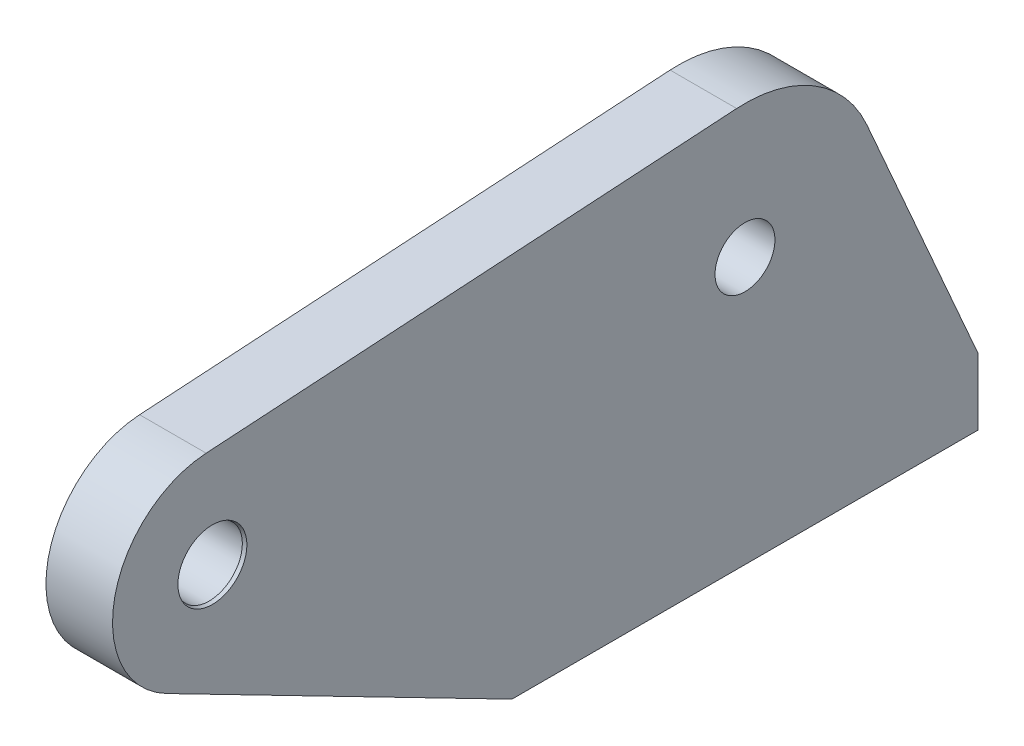
ISO-10303-21;
HEADER;
FILE_DESCRIPTION(('STEP AP214'),'2;1');
FILE_NAME('part.step','',(''),(''),'','','');
FILE_SCHEMA(('AUTOMOTIVE_DESIGN { 1 0 10303 214 1 1 1 1 }'));
ENDSEC;
DATA;
#1=APPLICATION_CONTEXT('core data for automotive mechanical design processes');
#2=APPLICATION_PROTOCOL_DEFINITION('international standard','automotive_design',2000,#1);
#3=PRODUCT_CONTEXT('',#1,'mechanical');
#4=PRODUCT('Part','Part','',(#3));
#5=PRODUCT_RELATED_PRODUCT_CATEGORY('part','',(#4));
#6=PRODUCT_DEFINITION_FORMATION('','',#4);
#7=PRODUCT_DEFINITION_CONTEXT('part definition',#1,'design');
#8=PRODUCT_DEFINITION('design','',#6,#7);
#9=PRODUCT_DEFINITION_SHAPE('','',#8);
#10=(LENGTH_UNIT() NAMED_UNIT(*) SI_UNIT(.MILLI.,.METRE.));
#11=(NAMED_UNIT(*) PLANE_ANGLE_UNIT() SI_UNIT($,.RADIAN.));
#12=(NAMED_UNIT(*) SI_UNIT($,.STERADIAN.) SOLID_ANGLE_UNIT());
#13=UNCERTAINTY_MEASURE_WITH_UNIT(LENGTH_MEASURE(1.E-05),#10,'distance_accuracy_value','');
#14=(GEOMETRIC_REPRESENTATION_CONTEXT(3) GLOBAL_UNCERTAINTY_ASSIGNED_CONTEXT((#13)) GLOBAL_UNIT_ASSIGNED_CONTEXT((#10,
#11,#12)) REPRESENTATION_CONTEXT('',''));
#15=CARTESIAN_POINT('',(0.,0.,0.));
#16=DIRECTION('',(0.,0.,1.));
#17=DIRECTION('',(1.,0.,0.));
#18=AXIS2_PLACEMENT_3D('',#15,#16,#17);
#19=CARTESIAN_POINT('',(5.,0.,0.));
#20=DIRECTION('',(-1.,0.,0.));
#21=DIRECTION('',(0.,0.,1.));
#22=AXIS2_PLACEMENT_3D('',#19,#20,#21);
#23=CYLINDRICAL_SURFACE('',#22,20.);
#24=DIRECTION('',(1.,0.,0.));
#25=VECTOR('',#24,1.);
#26=CARTESIAN_POINT('',(-5.,19.9608992783391,1.25));
#27=LINE('',#26,#25);
#28=CARTESIAN_POINT('',(-5.,19.9608992783391,1.25));
#29=VERTEX_POINT('',#28);
#30=CARTESIAN_POINT('',(5.,19.9608992783391,1.25));
#31=VERTEX_POINT('',#30);
#32=EDGE_CURVE('E78',#29,#31,#27,.T.);
#33=ORIENTED_EDGE('',*,*,#32,.T.);
#34=CARTESIAN_POINT('',(5.,0.,0.));
#35=DIRECTION('',(1.,0.,0.));
#36=DIRECTION('',(0.,0.,-1.));
#37=AXIS2_PLACEMENT_3D('',#34,#35,#36);
#38=CIRCLE('',#37,20.);
#39=CARTESIAN_POINT('',(5.,8.03443930362977,-18.3152336888255));
#40=VERTEX_POINT('',#39);
#41=EDGE_CURVE('E234',#40,#31,#38,.T.);
#42=ORIENTED_EDGE('',*,*,#41,.F.);
#43=DIRECTION('',(-1.,0.,0.));
#44=VECTOR('',#43,1.);
#45=CARTESIAN_POINT('',(5.,8.03443930362977,-18.3152336888255));
#46=LINE('',#45,#44);
#47=CARTESIAN_POINT('',(-5.,8.03443930362977,-18.3152336888255));
#48=VERTEX_POINT('',#47);
#49=EDGE_CURVE('E237',#40,#48,#46,.T.);
#50=ORIENTED_EDGE('',*,*,#49,.T.);
#51=CARTESIAN_POINT('',(-5.,0.,0.));
#52=DIRECTION('',(1.,0.,0.));
#53=DIRECTION('',(0.,0.,-1.));
#54=AXIS2_PLACEMENT_3D('',#51,#52,#53);
#55=CIRCLE('',#54,20.);
#56=EDGE_CURVE('E84',#48,#29,#55,.T.);
#57=ORIENTED_EDGE('',*,*,#56,.T.);
#58=EDGE_LOOP('',(#33,#42,#50,#57));
#59=FACE_BOUND('',#58,.T.);
#60=ADVANCED_FACE('F58',(#59),#23,.T.);
#61=CARTESIAN_POINT('',(5.,-40.,35.));
#62=DIRECTION('',(0.,1.,0.));
#63=DIRECTION('',(0.,0.,1.));
#64=AXIS2_PLACEMENT_3D('',#61,#62,#63);
#65=PLANE('',#64);
#66=CARTESIAN_POINT('',(0.,-40.,25.));
#67=DIRECTION('',(0.,-1.,0.));
#68=DIRECTION('',(0.,0.,-1.));
#69=AXIS2_PLACEMENT_3D('',#66,#67,#68);
#70=CIRCLE('',#69,1.65);
#71=CARTESIAN_POINT('',(0.,-40.,23.35));
#72=VERTEX_POINT('',#71);
#73=EDGE_CURVE('E187',#72,#72,#70,.T.);
#74=ORIENTED_EDGE('',*,*,#73,.F.);
#75=EDGE_LOOP('',(#74));
#76=FACE_BOUND('',#75,.T.);
#77=CARTESIAN_POINT('',(0.,-40.,10.));
#78=DIRECTION('',(0.,-1.,0.));
#79=DIRECTION('',(0.,0.,-1.));
#80=AXIS2_PLACEMENT_3D('',#77,#78,#79);
#81=CIRCLE('',#80,1.65);
#82=CARTESIAN_POINT('',(0.,-40.,8.35000000000001));
#83=VERTEX_POINT('',#82);
#84=EDGE_CURVE('E197',#83,#83,#81,.T.);
#85=ORIENTED_EDGE('',*,*,#84,.F.);
#86=EDGE_LOOP('',(#85));
#87=FACE_BOUND('',#86,.T.);
#88=CARTESIAN_POINT('',(0.,-40.,-10.));
#89=DIRECTION('',(0.,-1.,0.));
#90=DIRECTION('',(0.,0.,-1.));
#91=AXIS2_PLACEMENT_3D('',#88,#89,#90);
#92=CIRCLE('',#91,1.65);
#93=CARTESIAN_POINT('',(0.,-40.,-11.65));
#94=VERTEX_POINT('',#93);
#95=EDGE_CURVE('E205',#94,#94,#92,.T.);
#96=ORIENTED_EDGE('',*,*,#95,.F.);
#97=EDGE_LOOP('',(#96));
#98=FACE_BOUND('',#97,.T.);
#99=CARTESIAN_POINT('',(0.,-40.,-25.));
#100=DIRECTION('',(0.,-1.,0.));
#101=DIRECTION('',(0.,0.,-1.));
#102=AXIS2_PLACEMENT_3D('',#99,#100,#101);
#103=CIRCLE('',#102,1.65);
#104=CARTESIAN_POINT('',(0.,-40.,-26.65));
#105=VERTEX_POINT('',#104);
#106=EDGE_CURVE('E212',#105,#105,#103,.T.);
#107=ORIENTED_EDGE('',*,*,#106,.F.);
#108=EDGE_LOOP('',(#107));
#109=FACE_BOUND('',#108,.T.);
#110=DIRECTION('',(0.,0.,-1.));
#111=VECTOR('',#110,1.);
#112=CARTESIAN_POINT('',(-5.,-40.,35.));
#113=LINE('',#112,#111);
#114=CARTESIAN_POINT('',(-5.,-40.,35.));
#115=VERTEX_POINT('',#114);
#116=CARTESIAN_POINT('',(-5.,-40.,-35.));
#117=VERTEX_POINT('',#116);
#118=EDGE_CURVE('E165',#115,#117,#113,.T.);
#119=ORIENTED_EDGE('',*,*,#118,.T.);
#120=DIRECTION('',(-1.,0.,0.));
#121=VECTOR('',#120,1.);
#122=CARTESIAN_POINT('',(5.,-40.,-35.));
#123=LINE('',#122,#121);
#124=CARTESIAN_POINT('',(5.,-40.,-35.));
#125=VERTEX_POINT('',#124);
#126=EDGE_CURVE('E252',#125,#117,#123,.T.);
#127=ORIENTED_EDGE('',*,*,#126,.F.);
#128=DIRECTION('',(0.,0.,-1.));
#129=VECTOR('',#128,1.);
#130=CARTESIAN_POINT('',(5.,-40.,35.));
#131=LINE('',#130,#129);
#132=CARTESIAN_POINT('',(5.,-40.,35.));
#133=VERTEX_POINT('',#132);
#134=EDGE_CURVE('E226',#133,#125,#131,.T.);
#135=ORIENTED_EDGE('',*,*,#134,.F.);
#136=DIRECTION('',(-1.,0.,0.));
#137=VECTOR('',#136,1.);
#138=CARTESIAN_POINT('',(5.,-40.,35.));
#139=LINE('',#138,#137);
#140=EDGE_CURVE('E255',#133,#115,#139,.T.);
#141=ORIENTED_EDGE('',*,*,#140,.T.);
#142=EDGE_LOOP('',(#119,#127,#135,#141));
#143=FACE_BOUND('',#142,.T.);
#144=ADVANCED_FACE('F292',(#76,#87,#98,#109,#143),#65,.F.);
#145=CARTESIAN_POINT('',(5.,-30.,-35.));
#146=DIRECTION('',(0.,0.,1.));
#147=DIRECTION('',(0.,-1.,0.));
#148=AXIS2_PLACEMENT_3D('',#145,#146,#147);
#149=PLANE('',#148);
#150=DIRECTION('',(0.,1.,0.));
#151=VECTOR('',#150,1.);
#152=CARTESIAN_POINT('',(-5.,-30.,-35.));
#153=LINE('',#152,#151);
#154=CARTESIAN_POINT('',(-5.,-30.,-35.));
#155=VERTEX_POINT('',#154);
#156=EDGE_CURVE('E240',#117,#155,#153,.T.);
#157=ORIENTED_EDGE('',*,*,#156,.T.);
#158=DIRECTION('',(-1.,0.,0.));
#159=VECTOR('',#158,1.);
#160=CARTESIAN_POINT('',(5.,-30.,-35.));
#161=LINE('',#160,#159);
#162=CARTESIAN_POINT('',(5.,-30.,-35.));
#163=VERTEX_POINT('',#162);
#164=EDGE_CURVE('E249',#163,#155,#161,.T.);
#165=ORIENTED_EDGE('',*,*,#164,.F.);
#166=DIRECTION('',(0.,1.,0.));
#167=VECTOR('',#166,1.);
#168=CARTESIAN_POINT('',(5.,-30.,-35.));
#169=LINE('',#168,#167);
#170=EDGE_CURVE('E229',#125,#163,#169,.T.);
#171=ORIENTED_EDGE('',*,*,#170,.F.);
#172=ORIENTED_EDGE('',*,*,#126,.T.);
#173=EDGE_LOOP('',(#157,#165,#171,#172));
#174=FACE_BOUND('',#173,.T.);
#175=ADVANCED_FACE('F296',(#174),#149,.F.);
#176=CARTESIAN_POINT('',(5.,-30.,-35.));
#177=DIRECTION('',(0.,-0.401721965181489,0.915761684441276));
#178=DIRECTION('',(0.,-0.915761684441276,-0.401721965181489));
#179=AXIS2_PLACEMENT_3D('',#176,#177,#178);
#180=PLANE('',#179);
#181=DIRECTION('',(0.,0.915761684441276,0.401721965181489));
#182=VECTOR('',#181,1.);
#183=CARTESIAN_POINT('',(-5.,-30.,-35.));
#184=LINE('',#183,#182);
#185=EDGE_CURVE('E242',#155,#48,#184,.T.);
#186=ORIENTED_EDGE('',*,*,#185,.T.);
#187=ORIENTED_EDGE('',*,*,#49,.F.);
#188=DIRECTION('',(0.,0.915761684441276,0.401721965181489));
#189=VECTOR('',#188,1.);
#190=CARTESIAN_POINT('',(5.,-30.,-35.));
#191=LINE('',#190,#189);
#192=EDGE_CURVE('E231',#163,#40,#191,.T.);
#193=ORIENTED_EDGE('',*,*,#192,.F.);
#194=ORIENTED_EDGE('',*,*,#164,.T.);
#195=EDGE_LOOP('',(#186,#187,#193,#194));
#196=FACE_BOUND('',#195,.T.);
#197=ADVANCED_FACE('F287',(#196),#180,.F.);
#198=CARTESIAN_POINT('',(5.,0.,0.));
#199=DIRECTION('',(1.,0.,0.));
#200=DIRECTION('',(0.,0.,-1.));
#201=AXIS2_PLACEMENT_3D('',#198,#199,#200);
#202=PLANE('',#201);
#203=CARTESIAN_POINT('',(5.,0.,80.));
#204=DIRECTION('',(1.,0.,0.));
#205=DIRECTION('',(0.,0.,-1.));
#206=AXIS2_PLACEMENT_3D('',#203,#204,#205);
#207=CIRCLE('',#206,5.1819851171331);
#208=CARTESIAN_POINT('',(5.,0.,74.8180148828669));
#209=VERTEX_POINT('',#208);
#210=EDGE_CURVE('E11',#209,#209,#207,.F.);
#211=ORIENTED_EDGE('',*,*,#210,.T.);
#212=EDGE_LOOP('',(#211));
#213=FACE_BOUND('',#212,.T.);
#214=ORIENTED_EDGE('',*,*,#41,.T.);
#215=DIRECTION('',(0.,-0.0624999999999998,0.998044963916957));
#216=VECTOR('',#215,1.);
#217=CARTESIAN_POINT('',(5.,14.9706744587544,80.9375));
#218=LINE('',#217,#216);
#219=CARTESIAN_POINT('',(5.,14.9706744587544,80.9375));
#220=VERTEX_POINT('',#219);
#221=EDGE_CURVE('E171',#31,#220,#218,.T.);
#222=ORIENTED_EDGE('',*,*,#221,.T.);
#223=CARTESIAN_POINT('',(5.,0.,80.));
#224=DIRECTION('',(1.,0.,0.));
#225=DIRECTION('',(0.,0.,-1.));
#226=AXIS2_PLACEMENT_3D('',#223,#224,#225);
#227=CIRCLE('',#226,15.);
#228=CARTESIAN_POINT('',(5.,-13.340393183505,86.8581272742267));
#229=VERTEX_POINT('',#228);
#230=EDGE_CURVE('E181',#220,#229,#227,.T.);
#231=ORIENTED_EDGE('',*,*,#230,.T.);
#232=DIRECTION('',(0.,-0.457208484948447,-0.889359545567003));
#233=VECTOR('',#232,1.);
#234=CARTESIAN_POINT('',(5.,-13.340393183505,86.8581272742267));
#235=LINE('',#234,#233);
#236=EDGE_CURVE('E148',#229,#133,#235,.T.);
#237=ORIENTED_EDGE('',*,*,#236,.T.);
#238=ORIENTED_EDGE('',*,*,#134,.T.);
#239=ORIENTED_EDGE('',*,*,#170,.T.);
#240=ORIENTED_EDGE('',*,*,#192,.T.);
#241=EDGE_LOOP('',(#214,#222,#231,#237,#238,#239,#240));
#242=FACE_BOUND('',#241,.T.);
#243=CARTESIAN_POINT('',(5.,0.,0.));
#244=DIRECTION('',(1.,0.,0.));
#245=DIRECTION('',(0.,0.,-1.));
#246=AXIS2_PLACEMENT_3D('',#243,#244,#245);
#247=CIRCLE('',#246,4.5);
#248=CARTESIAN_POINT('',(5.,0.,-4.5));
#249=VERTEX_POINT('',#248);
#250=EDGE_CURVE('E218',#249,#249,#247,.T.);
#251=ORIENTED_EDGE('',*,*,#250,.F.);
#252=EDGE_LOOP('',(#251));
#253=FACE_BOUND('',#252,.T.);
#254=ADVANCED_FACE('F278',(#213,#242,#253),#202,.T.);
#255=CARTESIAN_POINT('',(-5.,0.,0.));
#256=DIRECTION('',(1.,0.,0.));
#257=DIRECTION('',(0.,0.,-1.));
#258=AXIS2_PLACEMENT_3D('',#255,#256,#257);
#259=PLANE('',#258);
#260=CARTESIAN_POINT('',(-5.,0.,80.));
#261=DIRECTION('',(1.,0.,0.));
#262=DIRECTION('',(0.,0.,-1.));
#263=AXIS2_PLACEMENT_3D('',#260,#261,#262);
#264=CIRCLE('',#263,5.1819851171331);
#265=CARTESIAN_POINT('',(-5.,0.,74.8180148828669));
#266=VERTEX_POINT('',#265);
#267=EDGE_CURVE('E258',#266,#266,#264,.T.);
#268=ORIENTED_EDGE('',*,*,#267,.T.);
#269=EDGE_LOOP('',(#268));
#270=FACE_BOUND('',#269,.T.);
#271=DIRECTION('',(0.,-0.0624999999999998,0.998044963916957));
#272=VECTOR('',#271,1.);
#273=CARTESIAN_POINT('',(-5.,14.9706744587544,80.9375));
#274=LINE('',#273,#272);
#275=CARTESIAN_POINT('',(-5.,14.9706744587544,80.9375));
#276=VERTEX_POINT('',#275);
#277=EDGE_CURVE('E154',#29,#276,#274,.T.);
#278=ORIENTED_EDGE('',*,*,#277,.F.);
#279=ORIENTED_EDGE('',*,*,#56,.F.);
#280=ORIENTED_EDGE('',*,*,#185,.F.);
#281=ORIENTED_EDGE('',*,*,#156,.F.);
#282=ORIENTED_EDGE('',*,*,#118,.F.);
#283=DIRECTION('',(0.,-0.457208484948447,-0.889359545567003));
#284=VECTOR('',#283,1.);
#285=CARTESIAN_POINT('',(-5.,-13.340393183505,86.8581272742267));
#286=LINE('',#285,#284);
#287=CARTESIAN_POINT('',(-5.,-13.340393183505,86.8581272742267));
#288=VERTEX_POINT('',#287);
#289=EDGE_CURVE('E146',#288,#115,#286,.T.);
#290=ORIENTED_EDGE('',*,*,#289,.F.);
#291=CARTESIAN_POINT('',(-5.,0.,80.));
#292=DIRECTION('',(1.,0.,0.));
#293=DIRECTION('',(0.,0.,-1.));
#294=AXIS2_PLACEMENT_3D('',#291,#292,#293);
#295=CIRCLE('',#294,15.);
#296=EDGE_CURVE('E162',#276,#288,#295,.T.);
#297=ORIENTED_EDGE('',*,*,#296,.F.);
#298=EDGE_LOOP('',(#278,#279,#280,#281,#282,#290,#297));
#299=FACE_BOUND('',#298,.T.);
#300=CARTESIAN_POINT('',(-5.,0.,0.));
#301=DIRECTION('',(1.,0.,0.));
#302=DIRECTION('',(0.,0.,-1.));
#303=AXIS2_PLACEMENT_3D('',#300,#301,#302);
#304=CIRCLE('',#303,4.5);
#305=CARTESIAN_POINT('',(-5.,0.,-4.5));
#306=VERTEX_POINT('',#305);
#307=EDGE_CURVE('E222',#306,#306,#304,.T.);
#308=ORIENTED_EDGE('',*,*,#307,.T.);
#309=EDGE_LOOP('',(#308));
#310=FACE_BOUND('',#309,.T.);
#311=ADVANCED_FACE('F160',(#270,#299,#310),#259,.F.);
#312=CARTESIAN_POINT('',(5.,0.,0.));
#313=DIRECTION('',(1.,0.,0.));
#314=DIRECTION('',(0.,0.,-1.));
#315=AXIS2_PLACEMENT_3D('',#312,#313,#314);
#316=CYLINDRICAL_SURFACE('',#315,4.5);
#317=ORIENTED_EDGE('',*,*,#307,.F.);
#318=EDGE_LOOP('',(#317));
#319=FACE_BOUND('',#318,.T.);
#320=ORIENTED_EDGE('',*,*,#250,.T.);
#321=EDGE_LOOP('',(#320));
#322=FACE_BOUND('',#321,.T.);
#323=ADVANCED_FACE('F277',(#319,#322),#316,.F.);
#324=CARTESIAN_POINT('',(0.,-28.5,-25.));
#325=DIRECTION('',(0.,-1.,0.));
#326=DIRECTION('',(0.,0.,-1.));
#327=AXIS2_PLACEMENT_3D('',#324,#325,#326);
#328=CONICAL_SURFACE('',#327,1.65,1.02974425867665);
#329=CARTESIAN_POINT('',(0.,-27.5085799786045,-25.));
#330=VERTEX_POINT('',#329);
#331=VERTEX_LOOP('',#330);
#332=FACE_BOUND('',#331,.T.);
#333=CARTESIAN_POINT('',(0.,-28.5,-25.));
#334=DIRECTION('',(0.,-1.,0.));
#335=DIRECTION('',(0.,0.,-1.));
#336=AXIS2_PLACEMENT_3D('',#333,#334,#335);
#337=CIRCLE('',#336,1.65);
#338=CARTESIAN_POINT('',(0.,-28.5,-26.65));
#339=VERTEX_POINT('',#338);
#340=EDGE_CURVE('E215',#339,#339,#337,.T.);
#341=ORIENTED_EDGE('',*,*,#340,.T.);
#342=EDGE_LOOP('',(#341));
#343=FACE_BOUND('',#342,.T.);
#344=ADVANCED_FACE('F283',(#332,#343),#328,.F.);
#345=CARTESIAN_POINT('',(0.,-40.,-25.));
#346=DIRECTION('',(0.,-1.,0.));
#347=DIRECTION('',(0.,0.,-1.));
#348=AXIS2_PLACEMENT_3D('',#345,#346,#347);
#349=CYLINDRICAL_SURFACE('',#348,1.65);
#350=ORIENTED_EDGE('',*,*,#340,.F.);
#351=EDGE_LOOP('',(#350));
#352=FACE_BOUND('',#351,.T.);
#353=ORIENTED_EDGE('',*,*,#106,.T.);
#354=EDGE_LOOP('',(#353));
#355=FACE_BOUND('',#354,.T.);
#356=ADVANCED_FACE('F359',(#352,#355),#349,.F.);
#357=CARTESIAN_POINT('',(0.,-28.5,-10.));
#358=DIRECTION('',(0.,-1.,0.));
#359=DIRECTION('',(0.,0.,-1.));
#360=AXIS2_PLACEMENT_3D('',#357,#358,#359);
#361=CONICAL_SURFACE('',#360,1.65,1.02974425867665);
#362=CARTESIAN_POINT('',(0.,-27.5085799786045,-10.));
#363=VERTEX_POINT('',#362);
#364=VERTEX_LOOP('',#363);
#365=FACE_BOUND('',#364,.T.);
#366=CARTESIAN_POINT('',(0.,-28.5,-10.));
#367=DIRECTION('',(0.,-1.,0.));
#368=DIRECTION('',(0.,0.,-1.));
#369=AXIS2_PLACEMENT_3D('',#366,#367,#368);
#370=CIRCLE('',#369,1.65);
#371=CARTESIAN_POINT('',(0.,-28.5,-11.65));
#372=VERTEX_POINT('',#371);
#373=EDGE_CURVE('E208',#372,#372,#370,.T.);
#374=ORIENTED_EDGE('',*,*,#373,.T.);
#375=EDGE_LOOP('',(#374));
#376=FACE_BOUND('',#375,.T.);
#377=ADVANCED_FACE('F355',(#365,#376),#361,.F.);
#378=CARTESIAN_POINT('',(0.,-40.,-10.));
#379=DIRECTION('',(0.,-1.,0.));
#380=DIRECTION('',(0.,0.,-1.));
#381=AXIS2_PLACEMENT_3D('',#378,#379,#380);
#382=CYLINDRICAL_SURFACE('',#381,1.65);
#383=ORIENTED_EDGE('',*,*,#373,.F.);
#384=EDGE_LOOP('',(#383));
#385=FACE_BOUND('',#384,.T.);
#386=ORIENTED_EDGE('',*,*,#95,.T.);
#387=EDGE_LOOP('',(#386));
#388=FACE_BOUND('',#387,.T.);
#389=ADVANCED_FACE('F351',(#385,#388),#382,.F.);
#390=CARTESIAN_POINT('',(0.,-28.5,10.));
#391=DIRECTION('',(0.,-1.,0.));
#392=DIRECTION('',(0.,0.,-1.));
#393=AXIS2_PLACEMENT_3D('',#390,#391,#392);
#394=CONICAL_SURFACE('',#393,1.65,1.02974425867665);
#395=CARTESIAN_POINT('',(0.,-27.5085799786045,10.));
#396=VERTEX_POINT('',#395);
#397=VERTEX_LOOP('',#396);
#398=FACE_BOUND('',#397,.T.);
#399=CARTESIAN_POINT('',(0.,-28.5,10.));
#400=DIRECTION('',(0.,-1.,0.));
#401=DIRECTION('',(0.,0.,-1.));
#402=AXIS2_PLACEMENT_3D('',#399,#400,#401);
#403=CIRCLE('',#402,1.65);
#404=CARTESIAN_POINT('',(0.,-28.5,8.35000000000001));
#405=VERTEX_POINT('',#404);
#406=EDGE_CURVE('E201',#405,#405,#403,.T.);
#407=ORIENTED_EDGE('',*,*,#406,.T.);
#408=EDGE_LOOP('',(#407));
#409=FACE_BOUND('',#408,.T.);
#410=ADVANCED_FACE('F347',(#398,#409),#394,.F.);
#411=CARTESIAN_POINT('',(0.,-40.,10.));
#412=DIRECTION('',(0.,-1.,0.));
#413=DIRECTION('',(0.,0.,-1.));
#414=AXIS2_PLACEMENT_3D('',#411,#412,#413);
#415=CYLINDRICAL_SURFACE('',#414,1.65);
#416=ORIENTED_EDGE('',*,*,#406,.F.);
#417=EDGE_LOOP('',(#416));
#418=FACE_BOUND('',#417,.T.);
#419=ORIENTED_EDGE('',*,*,#84,.T.);
#420=EDGE_LOOP('',(#419));
#421=FACE_BOUND('',#420,.T.);
#422=ADVANCED_FACE('F343',(#418,#421),#415,.F.);
#423=CARTESIAN_POINT('',(0.,-28.5,25.));
#424=DIRECTION('',(0.,-1.,0.));
#425=DIRECTION('',(0.,0.,-1.));
#426=AXIS2_PLACEMENT_3D('',#423,#424,#425);
#427=CONICAL_SURFACE('',#426,1.65,1.02974425867665);
#428=CARTESIAN_POINT('',(0.,-27.5085799786045,25.));
#429=VERTEX_POINT('',#428);
#430=VERTEX_LOOP('',#429);
#431=FACE_BOUND('',#430,.T.);
#432=CARTESIAN_POINT('',(0.,-28.5,25.));
#433=DIRECTION('',(0.,-1.,0.));
#434=DIRECTION('',(0.,0.,-1.));
#435=AXIS2_PLACEMENT_3D('',#432,#433,#434);
#436=CIRCLE('',#435,1.65);
#437=CARTESIAN_POINT('',(0.,-28.5,23.35));
#438=VERTEX_POINT('',#437);
#439=EDGE_CURVE('E193',#438,#438,#436,.T.);
#440=ORIENTED_EDGE('',*,*,#439,.T.);
#441=EDGE_LOOP('',(#440));
#442=FACE_BOUND('',#441,.T.);
#443=ADVANCED_FACE('F339',(#431,#442),#427,.F.);
#444=CARTESIAN_POINT('',(0.,-40.,25.));
#445=DIRECTION('',(0.,-1.,0.));
#446=DIRECTION('',(0.,0.,-1.));
#447=AXIS2_PLACEMENT_3D('',#444,#445,#446);
#448=CYLINDRICAL_SURFACE('',#447,1.65);
#449=ORIENTED_EDGE('',*,*,#439,.F.);
#450=EDGE_LOOP('',(#449));
#451=FACE_BOUND('',#450,.T.);
#452=ORIENTED_EDGE('',*,*,#73,.T.);
#453=EDGE_LOOP('',(#452));
#454=FACE_BOUND('',#453,.T.);
#455=ADVANCED_FACE('F333',(#451,#454),#448,.F.);
#456=CARTESIAN_POINT('',(-5.,0.,80.));
#457=DIRECTION('',(1.,0.,0.));
#458=DIRECTION('',(0.,0.,-1.));
#459=AXIS2_PLACEMENT_3D('',#456,#457,#458);
#460=CYLINDRICAL_SURFACE('',#459,15.);
#461=ORIENTED_EDGE('',*,*,#230,.F.);
#462=DIRECTION('',(1.,0.,0.));
#463=VECTOR('',#462,1.);
#464=CARTESIAN_POINT('',(-5.,14.9706744587544,80.9375));
#465=LINE('',#464,#463);
#466=EDGE_CURVE('E169',#276,#220,#465,.T.);
#467=ORIENTED_EDGE('',*,*,#466,.F.);
#468=ORIENTED_EDGE('',*,*,#296,.T.);
#469=DIRECTION('',(1.,0.,0.));
#470=VECTOR('',#469,1.);
#471=CARTESIAN_POINT('',(-5.,-13.340393183505,86.8581272742267));
#472=LINE('',#471,#470);
#473=EDGE_CURVE('E142',#288,#229,#472,.T.);
#474=ORIENTED_EDGE('',*,*,#473,.T.);
#475=EDGE_LOOP('',(#461,#467,#468,#474));
#476=FACE_BOUND('',#475,.T.);
#477=ADVANCED_FACE('F168',(#476),#460,.T.);
#478=CARTESIAN_POINT('',(-5.,14.9706744587544,80.9375));
#479=DIRECTION('',(0.,0.998044963916957,0.0624999999999999));
#480=DIRECTION('',(0.,-0.0624999999999999,0.998044963916957));
#481=AXIS2_PLACEMENT_3D('',#478,#479,#480);
#482=PLANE('',#481);
#483=ORIENTED_EDGE('',*,*,#221,.F.);
#484=ORIENTED_EDGE('',*,*,#32,.F.);
#485=ORIENTED_EDGE('',*,*,#277,.T.);
#486=ORIENTED_EDGE('',*,*,#466,.T.);
#487=EDGE_LOOP('',(#483,#484,#485,#486));
#488=FACE_BOUND('',#487,.T.);
#489=ADVANCED_FACE('F320',(#488),#482,.T.);
#490=CARTESIAN_POINT('',(-5.,-13.340393183505,86.8581272742267));
#491=DIRECTION('',(0.,-0.889359545567003,0.457208484948447));
#492=DIRECTION('',(0.,-0.457208484948447,-0.889359545567003));
#493=AXIS2_PLACEMENT_3D('',#490,#491,#492);
#494=PLANE('',#493);
#495=ORIENTED_EDGE('',*,*,#236,.F.);
#496=ORIENTED_EDGE('',*,*,#473,.F.);
#497=ORIENTED_EDGE('',*,*,#289,.T.);
#498=ORIENTED_EDGE('',*,*,#140,.F.);
#499=EDGE_LOOP('',(#495,#496,#497,#498));
#500=FACE_BOUND('',#499,.T.);
#501=ADVANCED_FACE('F144',(#500),#494,.T.);
#502=CARTESIAN_POINT('',(-5.,0.,80.));
#503=DIRECTION('',(1.,0.,0.));
#504=DIRECTION('',(0.,0.,-1.));
#505=AXIS2_PLACEMENT_3D('',#502,#503,#504);
#506=CYLINDRICAL_SURFACE('',#505,5.);
#507=CARTESIAN_POINT('',(-4.50000000000001,0.,80.));
#508=DIRECTION('',(1.,0.,0.));
#509=DIRECTION('',(0.,0.,-1.));
#510=AXIS2_PLACEMENT_3D('',#507,#508,#509);
#511=CIRCLE('',#510,5.);
#512=CARTESIAN_POINT('',(-4.50000000000001,0.,75.));
#513=VERTEX_POINT('',#512);
#514=EDGE_CURVE('E68',#513,#513,#511,.F.);
#515=ORIENTED_EDGE('',*,*,#514,.T.);
#516=EDGE_LOOP('',(#515));
#517=FACE_BOUND('',#516,.T.);
#518=CARTESIAN_POINT('',(4.50000000000001,0.,80.));
#519=DIRECTION('',(1.,0.,0.));
#520=DIRECTION('',(0.,0.,-1.));
#521=AXIS2_PLACEMENT_3D('',#518,#519,#520);
#522=CIRCLE('',#521,5.);
#523=CARTESIAN_POINT('',(4.50000000000001,0.,75.));
#524=VERTEX_POINT('',#523);
#525=EDGE_CURVE('E262',#524,#524,#522,.T.);
#526=ORIENTED_EDGE('',*,*,#525,.T.);
#527=EDGE_LOOP('',(#526));
#528=FACE_BOUND('',#527,.T.);
#529=ADVANCED_FACE('F268',(#517,#528),#506,.F.);
#530=CARTESIAN_POINT('',(-5.,0.,80.));
#531=DIRECTION('',(-1.,0.,0.));
#532=DIRECTION('',(0.,0.,1.));
#533=AXIS2_PLACEMENT_3D('',#530,#531,#532);
#534=CONICAL_SURFACE('',#533,5.1819851171331,0.349065850398852);
#535=ORIENTED_EDGE('',*,*,#514,.F.);
#536=EDGE_LOOP('',(#535));
#537=FACE_BOUND('',#536,.T.);
#538=ORIENTED_EDGE('',*,*,#267,.F.);
#539=EDGE_LOOP('',(#538));
#540=FACE_BOUND('',#539,.T.);
#541=ADVANCED_FACE('F271',(#537,#540),#534,.F.);
#542=CARTESIAN_POINT('',(4.50000000000001,0.,80.));
#543=DIRECTION('',(1.,0.,0.));
#544=DIRECTION('',(0.,0.,-1.));
#545=AXIS2_PLACEMENT_3D('',#542,#543,#544);
#546=CONICAL_SURFACE('',#545,5.,0.349065850398852);
#547=ORIENTED_EDGE('',*,*,#210,.F.);
#548=EDGE_LOOP('',(#547));
#549=FACE_BOUND('',#548,.T.);
#550=ORIENTED_EDGE('',*,*,#525,.F.);
#551=EDGE_LOOP('',(#550));
#552=FACE_BOUND('',#551,.T.);
#553=ADVANCED_FACE('F61',(#549,#552),#546,.F.);
#554=CLOSED_SHELL('',(#60,#144,#175,#197,#254,#311,#323,#344,#356,#377,#389,#410,#422,#443,#455,
#477,#489,#501,#529,#541,#553));
#555=MANIFOLD_SOLID_BREP('B2',#554);
#556=ADVANCED_BREP_SHAPE_REPRESENTATION('',(#18,#555),#14);
#557=SHAPE_DEFINITION_REPRESENTATION(#9,#556);
ENDSEC;
END-ISO-10303-21;
